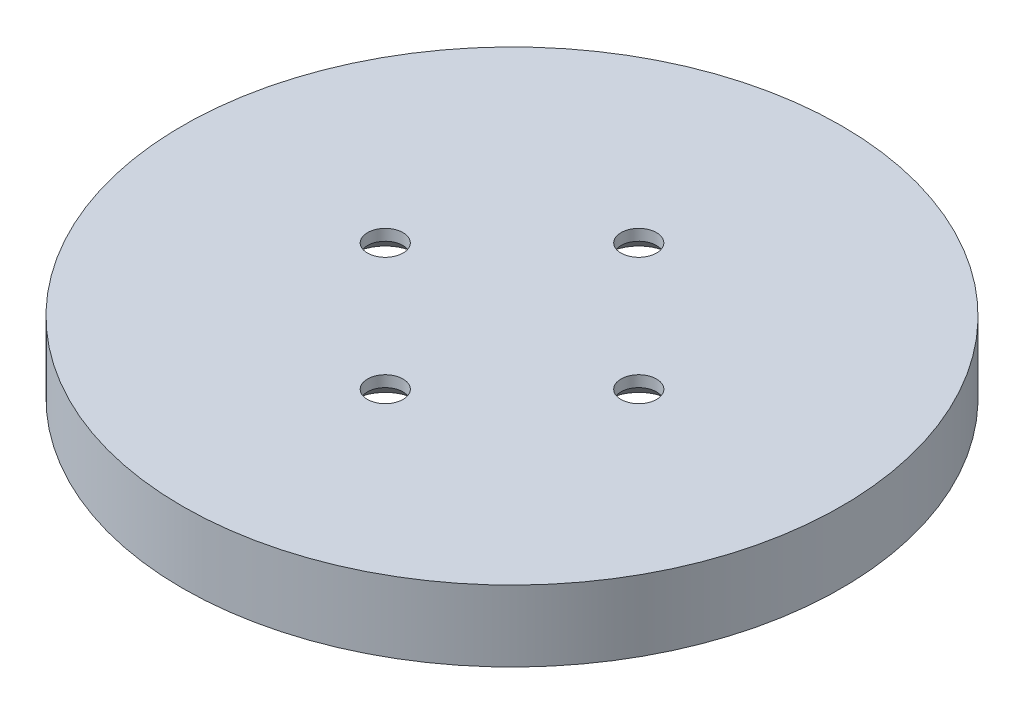
ISO-10303-21;
HEADER;
FILE_DESCRIPTION(('STEP AP214'),'2;1');
FILE_NAME('part.step','',(''),(''),'','','');
FILE_SCHEMA(('AUTOMOTIVE_DESIGN { 1 0 10303 214 1 1 1 1 }'));
ENDSEC;
DATA;
#1=APPLICATION_CONTEXT('core data for automotive mechanical design processes');
#2=APPLICATION_PROTOCOL_DEFINITION('international standard','automotive_design',2000,#1);
#3=PRODUCT_CONTEXT('',#1,'mechanical');
#4=PRODUCT('Part','Part','',(#3));
#5=PRODUCT_RELATED_PRODUCT_CATEGORY('part','',(#4));
#6=PRODUCT_DEFINITION_FORMATION('','',#4);
#7=PRODUCT_DEFINITION_CONTEXT('part definition',#1,'design');
#8=PRODUCT_DEFINITION('design','',#6,#7);
#9=PRODUCT_DEFINITION_SHAPE('','',#8);
#10=(LENGTH_UNIT() NAMED_UNIT(*) SI_UNIT(.MILLI.,.METRE.));
#11=(NAMED_UNIT(*) PLANE_ANGLE_UNIT() SI_UNIT($,.RADIAN.));
#12=(NAMED_UNIT(*) SI_UNIT($,.STERADIAN.) SOLID_ANGLE_UNIT());
#13=UNCERTAINTY_MEASURE_WITH_UNIT(LENGTH_MEASURE(1.E-05),#10,'distance_accuracy_value','');
#14=(GEOMETRIC_REPRESENTATION_CONTEXT(3) GLOBAL_UNCERTAINTY_ASSIGNED_CONTEXT((#13)) GLOBAL_UNIT_ASSIGNED_CONTEXT((#10,
#11,#12)) REPRESENTATION_CONTEXT('',''));
#15=CARTESIAN_POINT('',(0.,0.,0.));
#16=DIRECTION('',(0.,0.,1.));
#17=DIRECTION('',(1.,0.,0.));
#18=AXIS2_PLACEMENT_3D('',#15,#16,#17);
#19=CARTESIAN_POINT('',(0.,-54.,0.));
#20=DIRECTION('',(0.,1.,0.));
#21=DIRECTION('',(0.,0.,1.));
#22=AXIS2_PLACEMENT_3D('',#19,#20,#21);
#23=CYLINDRICAL_SURFACE('',#22,52.6);
#24=CARTESIAN_POINT('',(0.,3.,0.));
#25=DIRECTION('',(0.,-1.,0.));
#26=DIRECTION('',(0.,0.,-1.));
#27=AXIS2_PLACEMENT_3D('',#24,#25,#26);
#28=CIRCLE('',#27,52.6);
#29=CARTESIAN_POINT('',(-52.398473260201,3.,-4.6));
#30=VERTEX_POINT('',#29);
#31=CARTESIAN_POINT('',(52.398473260201,3.,-4.6));
#32=VERTEX_POINT('',#31);
#33=EDGE_CURVE('E324',#30,#32,#28,.T.);
#34=ORIENTED_EDGE('',*,*,#33,.T.);
#35=DIRECTION('',(0.,1.,0.));
#36=VECTOR('',#35,1.);
#37=CARTESIAN_POINT('',(52.398473260201,-54.,-4.6));
#38=LINE('',#37,#36);
#39=CARTESIAN_POINT('',(52.398473260201,6.8,-4.6));
#40=VERTEX_POINT('',#39);
#41=EDGE_CURVE('E168',#32,#40,#38,.T.);
#42=ORIENTED_EDGE('',*,*,#41,.T.);
#43=CARTESIAN_POINT('',(-8.46545056276682E-13,6.8,3.57353036051222E-13));
#44=DIRECTION('',(0.,1.,0.));
#45=DIRECTION('',(0.,0.,-1.));
#46=AXIS2_PLACEMENT_3D('',#43,#44,#45);
#47=CIRCLE('',#46,52.6000000000008);
#48=CARTESIAN_POINT('',(37.1938166904129,6.8,-37.1938166904119));
#49=VERTEX_POINT('',#48);
#50=EDGE_CURVE('E261',#40,#49,#47,.T.);
#51=ORIENTED_EDGE('',*,*,#50,.T.);
#52=DIRECTION('',(0.,1.,0.));
#53=VECTOR('',#52,1.);
#54=CARTESIAN_POINT('',(37.1938166904129,6.8,-37.1938166904119));
#55=LINE('',#54,#53);
#56=CARTESIAN_POINT('',(37.1938166904129,12.,-37.1938166904119));
#57=VERTEX_POINT('',#56);
#58=EDGE_CURVE('E220',#49,#57,#55,.T.);
#59=ORIENTED_EDGE('',*,*,#58,.T.);
#60=CARTESIAN_POINT('',(0.,12.,0.));
#61=DIRECTION('',(0.,1.,0.));
#62=DIRECTION('',(0.,0.,1.));
#63=AXIS2_PLACEMENT_3D('',#60,#61,#62);
#64=CIRCLE('',#63,52.6);
#65=CARTESIAN_POINT('',(-52.398473260201,12.,-4.6));
#66=VERTEX_POINT('',#65);
#67=EDGE_CURVE('E243',#66,#57,#64,.F.);
#68=ORIENTED_EDGE('',*,*,#67,.F.);
#69=DIRECTION('',(0.,1.,0.));
#70=VECTOR('',#69,1.);
#71=CARTESIAN_POINT('',(-52.398473260201,-54.,-4.6));
#72=LINE('',#71,#70);
#73=EDGE_CURVE('E167',#66,#30,#72,.F.);
#74=ORIENTED_EDGE('',*,*,#73,.T.);
#75=EDGE_LOOP('',(#34,#42,#51,#59,#68,#74));
#76=FACE_BOUND('',#75,.T.);
#77=ADVANCED_FACE('F34',(#76),#23,.F.);
#78=CARTESIAN_POINT('',(0.,3.,0.));
#79=DIRECTION('',(0.,-1.,0.));
#80=DIRECTION('',(0.,0.,1.));
#81=AXIS2_PLACEMENT_3D('',#78,#79,#80);
#82=CIRCLE('',#81,52.6);
#83=CARTESIAN_POINT('',(52.398473260201,3.,4.6));
#84=VERTEX_POINT('',#83);
#85=CARTESIAN_POINT('',(-52.398473260201,3.,4.6));
#86=VERTEX_POINT('',#85);
#87=EDGE_CURVE('E148',#84,#86,#82,.T.);
#88=ORIENTED_EDGE('',*,*,#87,.T.);
#89=DIRECTION('',(0.,1.,0.));
#90=VECTOR('',#89,1.);
#91=CARTESIAN_POINT('',(-52.398473260201,-54.,4.6));
#92=LINE('',#91,#90);
#93=CARTESIAN_POINT('',(-52.398473260201,6.8,4.6));
#94=VERTEX_POINT('',#93);
#95=EDGE_CURVE('E159',#86,#94,#92,.T.);
#96=ORIENTED_EDGE('',*,*,#95,.T.);
#97=CARTESIAN_POINT('',(2.08166817117217E-13,6.8,0.));
#98=DIRECTION('',(0.,1.,0.));
#99=DIRECTION('',(0.,0.,-1.));
#100=AXIS2_PLACEMENT_3D('',#97,#98,#99);
#101=CIRCLE('',#100,52.6000000000002);
#102=CARTESIAN_POINT('',(-37.1938166904022,6.8,37.1938166904226));
#103=VERTEX_POINT('',#102);
#104=EDGE_CURVE('E245',#94,#103,#101,.T.);
#105=ORIENTED_EDGE('',*,*,#104,.T.);
#106=DIRECTION('',(0.,1.,0.));
#107=VECTOR('',#106,1.);
#108=CARTESIAN_POINT('',(-37.1938166904022,6.8,37.1938166904226));
#109=LINE('',#108,#107);
#110=CARTESIAN_POINT('',(-37.1938166904022,12.,37.1938166904226));
#111=VERTEX_POINT('',#110);
#112=EDGE_CURVE('E227',#103,#111,#109,.T.);
#113=ORIENTED_EDGE('',*,*,#112,.T.);
#114=CARTESIAN_POINT('',(52.398473260201,12.,4.6));
#115=VERTEX_POINT('',#114);
#116=EDGE_CURVE('E276',#115,#111,#64,.F.);
#117=ORIENTED_EDGE('',*,*,#116,.F.);
#118=DIRECTION('',(0.,1.,0.));
#119=VECTOR('',#118,1.);
#120=CARTESIAN_POINT('',(52.398473260201,-54.,4.6));
#121=LINE('',#120,#119);
#122=EDGE_CURVE('E162',#115,#84,#121,.F.);
#123=ORIENTED_EDGE('',*,*,#122,.T.);
#124=EDGE_LOOP('',(#88,#96,#105,#113,#117,#123));
#125=FACE_BOUND('',#124,.T.);
#126=ADVANCED_FACE('F157',(#125),#23,.F.);
#127=CARTESIAN_POINT('',(0.,30.,0.));
#128=DIRECTION('',(0.,-1.,0.));
#129=DIRECTION('',(0.,0.,-1.));
#130=AXIS2_PLACEMENT_3D('',#127,#128,#129);
#131=CYLINDRICAL_SURFACE('',#130,65.);
#132=CARTESIAN_POINT('',(0.,17.,0.));
#133=DIRECTION('',(0.,1.,0.));
#134=DIRECTION('',(0.,0.,1.));
#135=AXIS2_PLACEMENT_3D('',#132,#133,#134);
#136=CIRCLE('',#135,65.);
#137=CARTESIAN_POINT('',(0.,17.,65.));
#138=VERTEX_POINT('',#137);
#139=EDGE_CURVE('E277',#138,#138,#136,.T.);
#140=ORIENTED_EDGE('',*,*,#139,.F.);
#141=EDGE_LOOP('',(#140));
#142=FACE_BOUND('',#141,.T.);
#143=CARTESIAN_POINT('',(0.,3.,0.));
#144=DIRECTION('',(0.,-1.,0.));
#145=DIRECTION('',(0.,0.,-1.));
#146=AXIS2_PLACEMENT_3D('',#143,#144,#145);
#147=CIRCLE('',#146,65.);
#148=CARTESIAN_POINT('',(0.,3.,-65.));
#149=VERTEX_POINT('',#148);
#150=EDGE_CURVE('E316',#149,#149,#147,.T.);
#151=ORIENTED_EDGE('',*,*,#150,.F.);
#152=EDGE_LOOP('',(#151));
#153=FACE_BOUND('',#152,.T.);
#154=ADVANCED_FACE('F36',(#142,#153),#131,.T.);
#155=CARTESIAN_POINT('',(60.7,12.,4.6));
#156=DIRECTION('',(1.,0.,0.));
#157=DIRECTION('',(0.,0.,-1.));
#158=AXIS2_PLACEMENT_3D('',#155,#156,#157);
#159=PLANE('',#158);
#160=DIRECTION('',(0.,0.,1.));
#161=VECTOR('',#160,1.);
#162=CARTESIAN_POINT('',(60.7,3.,4.6));
#163=LINE('',#162,#161);
#164=CARTESIAN_POINT('',(60.7,3.,-4.6));
#165=VERTEX_POINT('',#164);
#166=CARTESIAN_POINT('',(60.7,3.,4.6));
#167=VERTEX_POINT('',#166);
#168=EDGE_CURVE('E321',#165,#167,#163,.T.);
#169=ORIENTED_EDGE('',*,*,#168,.T.);
#170=DIRECTION('',(0.,-1.,0.));
#171=VECTOR('',#170,1.);
#172=CARTESIAN_POINT('',(60.7,12.,4.6));
#173=LINE('',#172,#171);
#174=CARTESIAN_POINT('',(60.7,12.,4.6));
#175=VERTEX_POINT('',#174);
#176=EDGE_CURVE('E195',#175,#167,#173,.T.);
#177=ORIENTED_EDGE('',*,*,#176,.F.);
#178=DIRECTION('',(0.,0.,1.));
#179=VECTOR('',#178,1.);
#180=CARTESIAN_POINT('',(60.7,12.,4.6));
#181=LINE('',#180,#179);
#182=CARTESIAN_POINT('',(60.7,12.,0.));
#183=VERTEX_POINT('',#182);
#184=EDGE_CURVE('E214',#183,#175,#181,.T.);
#185=ORIENTED_EDGE('',*,*,#184,.F.);
#186=DIRECTION('',(0.,1.,0.));
#187=VECTOR('',#186,1.);
#188=CARTESIAN_POINT('',(60.7,12.,0.));
#189=LINE('',#188,#187);
#190=CARTESIAN_POINT('',(60.7,6.8,0.));
#191=VERTEX_POINT('',#190);
#192=EDGE_CURVE('E11',#191,#183,#189,.T.);
#193=ORIENTED_EDGE('',*,*,#192,.F.);
#194=DIRECTION('',(0.,0.,-1.));
#195=VECTOR('',#194,1.);
#196=CARTESIAN_POINT('',(60.7,6.8,4.6));
#197=LINE('',#196,#195);
#198=CARTESIAN_POINT('',(60.7,6.8,-4.6));
#199=VERTEX_POINT('',#198);
#200=EDGE_CURVE('E42',#191,#199,#197,.T.);
#201=ORIENTED_EDGE('',*,*,#200,.T.);
#202=DIRECTION('',(0.,-1.,0.));
#203=VECTOR('',#202,1.);
#204=CARTESIAN_POINT('',(60.7,12.,-4.6));
#205=LINE('',#204,#203);
#206=EDGE_CURVE('E185',#199,#165,#205,.T.);
#207=ORIENTED_EDGE('',*,*,#206,.T.);
#208=EDGE_LOOP('',(#169,#177,#185,#193,#201,#207));
#209=FACE_BOUND('',#208,.T.);
#210=ADVANCED_FACE('F184',(#209),#159,.F.);
#211=CARTESIAN_POINT('',(-60.7,12.,4.6));
#212=DIRECTION('',(-1.,0.,0.));
#213=DIRECTION('',(0.,0.,1.));
#214=AXIS2_PLACEMENT_3D('',#211,#212,#213);
#215=PLANE('',#214);
#216=DIRECTION('',(0.,0.,-1.));
#217=VECTOR('',#216,1.);
#218=CARTESIAN_POINT('',(-60.7,3.,4.6));
#219=LINE('',#218,#217);
#220=CARTESIAN_POINT('',(-60.7,3.,4.6));
#221=VERTEX_POINT('',#220);
#222=CARTESIAN_POINT('',(-60.7,3.,-4.6));
#223=VERTEX_POINT('',#222);
#224=EDGE_CURVE('E49',#221,#223,#219,.T.);
#225=ORIENTED_EDGE('',*,*,#224,.T.);
#226=DIRECTION('',(0.,-1.,0.));
#227=VECTOR('',#226,1.);
#228=CARTESIAN_POINT('',(-60.7,12.,-4.6));
#229=LINE('',#228,#227);
#230=CARTESIAN_POINT('',(-60.7,12.,-4.6));
#231=VERTEX_POINT('',#230);
#232=EDGE_CURVE('E205',#231,#223,#229,.T.);
#233=ORIENTED_EDGE('',*,*,#232,.F.);
#234=DIRECTION('',(0.,0.,-1.));
#235=VECTOR('',#234,1.);
#236=CARTESIAN_POINT('',(-60.7,12.,4.6));
#237=LINE('',#236,#235);
#238=CARTESIAN_POINT('',(-60.7,12.,0.));
#239=VERTEX_POINT('',#238);
#240=EDGE_CURVE('E194',#239,#231,#237,.T.);
#241=ORIENTED_EDGE('',*,*,#240,.F.);
#242=DIRECTION('',(0.,1.,0.));
#243=VECTOR('',#242,1.);
#244=CARTESIAN_POINT('',(-60.7,12.,0.));
#245=LINE('',#244,#243);
#246=CARTESIAN_POINT('',(-60.7,6.8,0.));
#247=VERTEX_POINT('',#246);
#248=EDGE_CURVE('E178',#247,#239,#245,.T.);
#249=ORIENTED_EDGE('',*,*,#248,.F.);
#250=DIRECTION('',(0.,0.,1.));
#251=VECTOR('',#250,1.);
#252=CARTESIAN_POINT('',(-60.7,6.8,4.6));
#253=LINE('',#252,#251);
#254=CARTESIAN_POINT('',(-60.7,6.8,4.6));
#255=VERTEX_POINT('',#254);
#256=EDGE_CURVE('E171',#247,#255,#253,.T.);
#257=ORIENTED_EDGE('',*,*,#256,.T.);
#258=DIRECTION('',(0.,-1.,0.));
#259=VECTOR('',#258,1.);
#260=CARTESIAN_POINT('',(-60.7,12.,4.6));
#261=LINE('',#260,#259);
#262=EDGE_CURVE('E207',#255,#221,#261,.T.);
#263=ORIENTED_EDGE('',*,*,#262,.T.);
#264=EDGE_LOOP('',(#225,#233,#241,#249,#257,#263));
#265=FACE_BOUND('',#264,.T.);
#266=ADVANCED_FACE('F330',(#265),#215,.F.);
#267=CARTESIAN_POINT('',(44.5,12.,-4.6));
#268=DIRECTION('',(0.,0.,-1.));
#269=DIRECTION('',(-1.,0.,0.));
#270=AXIS2_PLACEMENT_3D('',#267,#268,#269);
#271=PLANE('',#270);
#272=DIRECTION('',(1.,0.,0.));
#273=VECTOR('',#272,1.);
#274=CARTESIAN_POINT('',(60.7,3.,-4.6));
#275=LINE('',#274,#273);
#276=EDGE_CURVE('E193',#32,#165,#275,.T.);
#277=ORIENTED_EDGE('',*,*,#276,.T.);
#278=ORIENTED_EDGE('',*,*,#206,.F.);
#279=DIRECTION('',(-1.,0.,0.));
#280=VECTOR('',#279,1.);
#281=CARTESIAN_POINT('',(44.5,6.8,-4.6));
#282=LINE('',#281,#280);
#283=EDGE_CURVE('E57',#199,#40,#282,.T.);
#284=ORIENTED_EDGE('',*,*,#283,.T.);
#285=ORIENTED_EDGE('',*,*,#41,.F.);
#286=EDGE_LOOP('',(#277,#278,#284,#285));
#287=FACE_BOUND('',#286,.T.);
#288=ADVANCED_FACE('F191',(#287),#271,.F.);
#289=CARTESIAN_POINT('',(44.5,12.,4.6));
#290=DIRECTION('',(0.,0.,1.));
#291=DIRECTION('',(1.,0.,0.));
#292=AXIS2_PLACEMENT_3D('',#289,#290,#291);
#293=PLANE('',#292);
#294=DIRECTION('',(-1.,0.,0.));
#295=VECTOR('',#294,1.);
#296=CARTESIAN_POINT('',(52.398473260201,3.,4.6));
#297=LINE('',#296,#295);
#298=EDGE_CURVE('E319',#167,#84,#297,.T.);
#299=ORIENTED_EDGE('',*,*,#298,.T.);
#300=ORIENTED_EDGE('',*,*,#122,.F.);
#301=DIRECTION('',(-1.,0.,0.));
#302=VECTOR('',#301,1.);
#303=CARTESIAN_POINT('',(44.5,12.,4.6));
#304=LINE('',#303,#302);
#305=EDGE_CURVE('E201',#175,#115,#304,.T.);
#306=ORIENTED_EDGE('',*,*,#305,.F.);
#307=ORIENTED_EDGE('',*,*,#176,.T.);
#308=EDGE_LOOP('',(#299,#300,#306,#307));
#309=FACE_BOUND('',#308,.T.);
#310=ADVANCED_FACE('F351',(#309),#293,.F.);
#311=CARTESIAN_POINT('',(-60.7,12.,-4.6));
#312=DIRECTION('',(0.,0.,-1.));
#313=DIRECTION('',(-1.,0.,0.));
#314=AXIS2_PLACEMENT_3D('',#311,#312,#313);
#315=PLANE('',#314);
#316=DIRECTION('',(1.,0.,0.));
#317=VECTOR('',#316,1.);
#318=CARTESIAN_POINT('',(-60.7,3.,-4.6));
#319=LINE('',#318,#317);
#320=EDGE_CURVE('E327',#223,#30,#319,.T.);
#321=ORIENTED_EDGE('',*,*,#320,.T.);
#322=ORIENTED_EDGE('',*,*,#73,.F.);
#323=DIRECTION('',(1.,0.,0.));
#324=VECTOR('',#323,1.);
#325=CARTESIAN_POINT('',(-60.7,12.,-4.6));
#326=LINE('',#325,#324);
#327=EDGE_CURVE('E198',#231,#66,#326,.T.);
#328=ORIENTED_EDGE('',*,*,#327,.F.);
#329=ORIENTED_EDGE('',*,*,#232,.T.);
#330=EDGE_LOOP('',(#321,#322,#328,#329));
#331=FACE_BOUND('',#330,.T.);
#332=ADVANCED_FACE('F367',(#331),#315,.F.);
#333=CARTESIAN_POINT('',(-60.7,12.,4.6));
#334=DIRECTION('',(0.,0.,1.));
#335=DIRECTION('',(1.,0.,0.));
#336=AXIS2_PLACEMENT_3D('',#333,#334,#335);
#337=PLANE('',#336);
#338=DIRECTION('',(-1.,0.,0.));
#339=VECTOR('',#338,1.);
#340=CARTESIAN_POINT('',(-52.398473260201,3.,4.6));
#341=LINE('',#340,#339);
#342=EDGE_CURVE('E144',#86,#221,#341,.T.);
#343=ORIENTED_EDGE('',*,*,#342,.T.);
#344=ORIENTED_EDGE('',*,*,#262,.F.);
#345=DIRECTION('',(1.,0.,0.));
#346=VECTOR('',#345,1.);
#347=CARTESIAN_POINT('',(-60.7,6.8,4.6));
#348=LINE('',#347,#346);
#349=EDGE_CURVE('E166',#255,#94,#348,.T.);
#350=ORIENTED_EDGE('',*,*,#349,.T.);
#351=ORIENTED_EDGE('',*,*,#95,.F.);
#352=EDGE_LOOP('',(#343,#344,#350,#351));
#353=FACE_BOUND('',#352,.T.);
#354=ADVANCED_FACE('F165',(#353),#337,.F.);
#355=CARTESIAN_POINT('',(-52.6,6.8,0.));
#356=DIRECTION('',(0.,0.,1.));
#357=DIRECTION('',(1.,0.,0.));
#358=AXIS2_PLACEMENT_3D('',#355,#356,#357);
#359=PLANE('',#358);
#360=ORIENTED_EDGE('',*,*,#248,.T.);
#361=DIRECTION('',(1.,0.,0.));
#362=VECTOR('',#361,1.);
#363=CARTESIAN_POINT('',(-52.6,12.,0.));
#364=LINE('',#363,#362);
#365=CARTESIAN_POINT('',(-62.3248280176807,12.,0.));
#366=VERTEX_POINT('',#365);
#367=EDGE_CURVE('E237',#366,#239,#364,.T.);
#368=ORIENTED_EDGE('',*,*,#367,.F.);
#369=DIRECTION('',(0.,1.,0.));
#370=VECTOR('',#369,1.);
#371=CARTESIAN_POINT('',(-62.3248280176807,6.8,0.));
#372=LINE('',#371,#370);
#373=CARTESIAN_POINT('',(-62.3248280176807,6.8,0.));
#374=VERTEX_POINT('',#373);
#375=EDGE_CURVE('E223',#374,#366,#372,.T.);
#376=ORIENTED_EDGE('',*,*,#375,.F.);
#377=DIRECTION('',(1.,0.,0.));
#378=VECTOR('',#377,1.);
#379=CARTESIAN_POINT('',(-52.6,6.8,0.));
#380=LINE('',#379,#378);
#381=EDGE_CURVE('E247',#374,#247,#380,.T.);
#382=ORIENTED_EDGE('',*,*,#381,.T.);
#383=EDGE_LOOP('',(#360,#368,#376,#382));
#384=FACE_BOUND('',#383,.T.);
#385=ADVANCED_FACE('F338',(#384),#359,.T.);
#386=CARTESIAN_POINT('',(0.,6.8,0.));
#387=DIRECTION('',(0.,-1.,0.));
#388=DIRECTION('',(0.,0.,-1.));
#389=AXIS2_PLACEMENT_3D('',#386,#387,#388);
#390=PLANE('',#389);
#391=ORIENTED_EDGE('',*,*,#256,.F.);
#392=ORIENTED_EDGE('',*,*,#381,.F.);
#393=CARTESIAN_POINT('',(0.,6.8,0.));
#394=DIRECTION('',(0.,-1.,0.));
#395=DIRECTION('',(0.,0.,-1.));
#396=AXIS2_PLACEMENT_3D('',#393,#394,#395);
#397=CIRCLE('',#396,62.3248280176807);
#398=CARTESIAN_POINT('',(-44.0703085275763,6.8,44.0703085275984));
#399=VERTEX_POINT('',#398);
#400=EDGE_CURVE('E236',#399,#374,#397,.T.);
#401=ORIENTED_EDGE('',*,*,#400,.F.);
#402=DIRECTION('',(-0.707106781186456,0.,0.707106781186639));
#403=VECTOR('',#402,1.);
#404=CARTESIAN_POINT('',(-37.1938166904022,6.8,37.1938166904226));
#405=LINE('',#404,#403);
#406=EDGE_CURVE('E232',#103,#399,#405,.T.);
#407=ORIENTED_EDGE('',*,*,#406,.F.);
#408=ORIENTED_EDGE('',*,*,#104,.F.);
#409=ORIENTED_EDGE('',*,*,#349,.F.);
#410=EDGE_LOOP('',(#391,#392,#401,#407,#408,#409));
#411=FACE_BOUND('',#410,.T.);
#412=ADVANCED_FACE('F334',(#411),#390,.F.);
#413=CARTESIAN_POINT('',(0.,6.8,0.));
#414=DIRECTION('',(0.,1.,0.));
#415=DIRECTION('',(0.,0.,1.));
#416=AXIS2_PLACEMENT_3D('',#413,#414,#415);
#417=CYLINDRICAL_SURFACE('',#416,62.3248280176807);
#418=CARTESIAN_POINT('',(0.,12.,0.));
#419=DIRECTION('',(0.,-1.,0.));
#420=DIRECTION('',(0.,0.,-1.));
#421=AXIS2_PLACEMENT_3D('',#418,#419,#420);
#422=CIRCLE('',#421,62.3248280176807);
#423=CARTESIAN_POINT('',(-44.0703085275763,12.,44.0703085275984));
#424=VERTEX_POINT('',#423);
#425=EDGE_CURVE('E240',#424,#366,#422,.T.);
#426=ORIENTED_EDGE('',*,*,#425,.F.);
#427=DIRECTION('',(0.,1.,0.));
#428=VECTOR('',#427,1.);
#429=CARTESIAN_POINT('',(-44.0703085275763,6.8,44.0703085275984));
#430=LINE('',#429,#428);
#431=EDGE_CURVE('E230',#399,#424,#430,.T.);
#432=ORIENTED_EDGE('',*,*,#431,.F.);
#433=ORIENTED_EDGE('',*,*,#400,.T.);
#434=ORIENTED_EDGE('',*,*,#375,.T.);
#435=EDGE_LOOP('',(#426,#432,#433,#434));
#436=FACE_BOUND('',#435,.T.);
#437=ADVANCED_FACE('F341',(#436),#417,.F.);
#438=CARTESIAN_POINT('',(-37.1938166904022,6.8,37.1938166904226));
#439=DIRECTION('',(-0.707106781186639,0.,-0.707106781186456));
#440=DIRECTION('',(-0.707106781186456,0.,0.707106781186639));
#441=AXIS2_PLACEMENT_3D('',#438,#439,#440);
#442=PLANE('',#441);
#443=DIRECTION('',(-0.707106781186456,0.,0.707106781186639));
#444=VECTOR('',#443,1.);
#445=CARTESIAN_POINT('',(-37.1938166904022,12.,37.1938166904226));
#446=LINE('',#445,#444);
#447=EDGE_CURVE('E233',#111,#424,#446,.T.);
#448=ORIENTED_EDGE('',*,*,#447,.F.);
#449=ORIENTED_EDGE('',*,*,#112,.F.);
#450=ORIENTED_EDGE('',*,*,#406,.T.);
#451=ORIENTED_EDGE('',*,*,#431,.T.);
#452=EDGE_LOOP('',(#448,#449,#450,#451));
#453=FACE_BOUND('',#452,.T.);
#454=ADVANCED_FACE('F347',(#453),#442,.T.);
#455=CARTESIAN_POINT('',(52.6,6.8,0.));
#456=DIRECTION('',(0.,0.,-1.));
#457=DIRECTION('',(-1.,0.,0.));
#458=AXIS2_PLACEMENT_3D('',#455,#456,#457);
#459=PLANE('',#458);
#460=ORIENTED_EDGE('',*,*,#192,.T.);
#461=DIRECTION('',(-1.,0.,0.));
#462=VECTOR('',#461,1.);
#463=CARTESIAN_POINT('',(52.6,12.,0.));
#464=LINE('',#463,#462);
#465=CARTESIAN_POINT('',(62.3248280176807,12.,0.));
#466=VERTEX_POINT('',#465);
#467=EDGE_CURVE('E259',#466,#183,#464,.T.);
#468=ORIENTED_EDGE('',*,*,#467,.F.);
#469=DIRECTION('',(0.,1.,0.));
#470=VECTOR('',#469,1.);
#471=CARTESIAN_POINT('',(62.3248280176807,6.8,0.));
#472=LINE('',#471,#470);
#473=CARTESIAN_POINT('',(62.3248280176807,6.8,0.));
#474=VERTEX_POINT('',#473);
#475=EDGE_CURVE('E256',#474,#466,#472,.T.);
#476=ORIENTED_EDGE('',*,*,#475,.F.);
#477=DIRECTION('',(-1.,0.,0.));
#478=VECTOR('',#477,1.);
#479=CARTESIAN_POINT('',(52.6,6.8,0.));
#480=LINE('',#479,#478);
#481=EDGE_CURVE('E258',#474,#191,#480,.T.);
#482=ORIENTED_EDGE('',*,*,#481,.T.);
#483=EDGE_LOOP('',(#460,#468,#476,#482));
#484=FACE_BOUND('',#483,.T.);
#485=ADVANCED_FACE('F356',(#484),#459,.T.);
#486=CARTESIAN_POINT('',(-8.46545056276682E-13,6.8,3.57353036051222E-13));
#487=DIRECTION('',(0.,-1.,0.));
#488=DIRECTION('',(0.,0.,-1.));
#489=AXIS2_PLACEMENT_3D('',#486,#487,#488);
#490=PLANE('',#489);
#491=ORIENTED_EDGE('',*,*,#200,.F.);
#492=ORIENTED_EDGE('',*,*,#481,.F.);
#493=CARTESIAN_POINT('',(0.,6.8,0.));
#494=DIRECTION('',(0.,-1.,0.));
#495=DIRECTION('',(0.,0.,-1.));
#496=AXIS2_PLACEMENT_3D('',#493,#494,#495);
#497=CIRCLE('',#496,62.3248280176807);
#498=CARTESIAN_POINT('',(44.0703085275869,6.8,-44.0703085275878));
#499=VERTEX_POINT('',#498);
#500=EDGE_CURVE('E268',#499,#474,#497,.T.);
#501=ORIENTED_EDGE('',*,*,#500,.F.);
#502=DIRECTION('',(0.707106781186455,0.,-0.70710678118664));
#503=VECTOR('',#502,1.);
#504=CARTESIAN_POINT('',(37.1938166904129,6.8,-37.1938166904119));
#505=LINE('',#504,#503);
#506=EDGE_CURVE('E270',#49,#499,#505,.T.);
#507=ORIENTED_EDGE('',*,*,#506,.F.);
#508=ORIENTED_EDGE('',*,*,#50,.F.);
#509=ORIENTED_EDGE('',*,*,#283,.F.);
#510=EDGE_LOOP('',(#491,#492,#501,#507,#508,#509));
#511=FACE_BOUND('',#510,.T.);
#512=ADVANCED_FACE('F358',(#511),#490,.F.);
#513=CARTESIAN_POINT('',(37.1938166904129,6.8,-37.1938166904119));
#514=DIRECTION('',(0.70710678118664,0.,0.707106781186455));
#515=DIRECTION('',(0.707106781186455,0.,-0.70710678118664));
#516=AXIS2_PLACEMENT_3D('',#513,#514,#515);
#517=PLANE('',#516);
#518=DIRECTION('',(0.707106781186455,0.,-0.70710678118664));
#519=VECTOR('',#518,1.);
#520=CARTESIAN_POINT('',(37.1938166904129,12.,-37.1938166904119));
#521=LINE('',#520,#519);
#522=CARTESIAN_POINT('',(44.0703085275869,12.,-44.0703085275878));
#523=VERTEX_POINT('',#522);
#524=EDGE_CURVE('E226',#57,#523,#521,.T.);
#525=ORIENTED_EDGE('',*,*,#524,.F.);
#526=ORIENTED_EDGE('',*,*,#58,.F.);
#527=ORIENTED_EDGE('',*,*,#506,.T.);
#528=DIRECTION('',(0.,1.,0.));
#529=VECTOR('',#528,1.);
#530=CARTESIAN_POINT('',(44.0703085275869,6.8,-44.0703085275878));
#531=LINE('',#530,#529);
#532=EDGE_CURVE('E254',#499,#523,#531,.T.);
#533=ORIENTED_EDGE('',*,*,#532,.T.);
#534=EDGE_LOOP('',(#525,#526,#527,#533));
#535=FACE_BOUND('',#534,.T.);
#536=ADVANCED_FACE('F364',(#535),#517,.T.);
#537=CARTESIAN_POINT('',(0.,6.8,0.));
#538=DIRECTION('',(0.,1.,0.));
#539=DIRECTION('',(0.,0.,1.));
#540=AXIS2_PLACEMENT_3D('',#537,#538,#539);
#541=CYLINDRICAL_SURFACE('',#540,62.3248280176807);
#542=CARTESIAN_POINT('',(0.,12.,0.));
#543=DIRECTION('',(0.,-1.,0.));
#544=DIRECTION('',(0.,0.,-1.));
#545=AXIS2_PLACEMENT_3D('',#542,#543,#544);
#546=CIRCLE('',#545,62.3248280176807);
#547=EDGE_CURVE('E262',#523,#466,#546,.T.);
#548=ORIENTED_EDGE('',*,*,#547,.F.);
#549=ORIENTED_EDGE('',*,*,#532,.F.);
#550=ORIENTED_EDGE('',*,*,#500,.T.);
#551=ORIENTED_EDGE('',*,*,#475,.T.);
#552=EDGE_LOOP('',(#548,#549,#550,#551));
#553=FACE_BOUND('',#552,.T.);
#554=ADVANCED_FACE('F362',(#553),#541,.F.);
#555=CARTESIAN_POINT('',(0.,12.,0.));
#556=DIRECTION('',(0.,1.,0.));
#557=DIRECTION('',(0.,0.,1.));
#558=AXIS2_PLACEMENT_3D('',#555,#556,#557);
#559=PLANE('',#558);
#560=CARTESIAN_POINT('',(-25.,12.,0.));
#561=DIRECTION('',(0.,-1.,0.));
#562=DIRECTION('',(0.,0.,-1.));
#563=AXIS2_PLACEMENT_3D('',#560,#561,#562);
#564=CIRCLE('',#563,6.3);
#565=CARTESIAN_POINT('',(-25.,12.,-6.3));
#566=VERTEX_POINT('',#565);
#567=EDGE_CURVE('E313',#566,#566,#564,.T.);
#568=ORIENTED_EDGE('',*,*,#567,.F.);
#569=EDGE_LOOP('',(#568));
#570=FACE_BOUND('',#569,.T.);
#571=CARTESIAN_POINT('',(0.,12.,25.));
#572=DIRECTION('',(0.,-1.,0.));
#573=DIRECTION('',(0.,0.,-1.));
#574=AXIS2_PLACEMENT_3D('',#571,#572,#573);
#575=CIRCLE('',#574,6.3);
#576=CARTESIAN_POINT('',(0.,12.,18.7));
#577=VERTEX_POINT('',#576);
#578=EDGE_CURVE('E304',#577,#577,#575,.T.);
#579=ORIENTED_EDGE('',*,*,#578,.F.);
#580=EDGE_LOOP('',(#579));
#581=FACE_BOUND('',#580,.T.);
#582=CARTESIAN_POINT('',(0.,12.,-25.));
#583=DIRECTION('',(0.,-1.,0.));
#584=DIRECTION('',(0.,0.,-1.));
#585=AXIS2_PLACEMENT_3D('',#582,#583,#584);
#586=CIRCLE('',#585,6.3);
#587=CARTESIAN_POINT('',(0.,12.,-31.3));
#588=VERTEX_POINT('',#587);
#589=EDGE_CURVE('E295',#588,#588,#586,.T.);
#590=ORIENTED_EDGE('',*,*,#589,.F.);
#591=EDGE_LOOP('',(#590));
#592=FACE_BOUND('',#591,.T.);
#593=CARTESIAN_POINT('',(25.,12.,0.));
#594=DIRECTION('',(0.,-1.,0.));
#595=DIRECTION('',(0.,0.,-1.));
#596=AXIS2_PLACEMENT_3D('',#593,#594,#595);
#597=CIRCLE('',#596,6.3);
#598=CARTESIAN_POINT('',(25.,12.,-6.3));
#599=VERTEX_POINT('',#598);
#600=EDGE_CURVE('E286',#599,#599,#597,.T.);
#601=ORIENTED_EDGE('',*,*,#600,.F.);
#602=EDGE_LOOP('',(#601));
#603=FACE_BOUND('',#602,.T.);
#604=ORIENTED_EDGE('',*,*,#327,.T.);
#605=ORIENTED_EDGE('',*,*,#67,.T.);
#606=ORIENTED_EDGE('',*,*,#524,.T.);
#607=ORIENTED_EDGE('',*,*,#547,.T.);
#608=ORIENTED_EDGE('',*,*,#467,.T.);
#609=ORIENTED_EDGE('',*,*,#184,.T.);
#610=ORIENTED_EDGE('',*,*,#305,.T.);
#611=ORIENTED_EDGE('',*,*,#116,.T.);
#612=ORIENTED_EDGE('',*,*,#447,.T.);
#613=ORIENTED_EDGE('',*,*,#425,.T.);
#614=ORIENTED_EDGE('',*,*,#367,.T.);
#615=ORIENTED_EDGE('',*,*,#240,.T.);
#616=EDGE_LOOP('',(#604,#605,#606,#607,#608,#609,#610,#611,#612,#613,#614,#615));
#617=FACE_BOUND('',#616,.T.);
#618=ADVANCED_FACE('F344',(#570,#581,#592,#603,#617),#559,.F.);
#619=CARTESIAN_POINT('',(0.,17.,0.));
#620=DIRECTION('',(0.,1.,0.));
#621=DIRECTION('',(0.,0.,1.));
#622=AXIS2_PLACEMENT_3D('',#619,#620,#621);
#623=PLANE('',#622);
#624=CARTESIAN_POINT('',(-25.,17.,0.));
#625=DIRECTION('',(0.,-1.,0.));
#626=DIRECTION('',(0.,0.,-1.));
#627=AXIS2_PLACEMENT_3D('',#624,#625,#626);
#628=CIRCLE('',#627,3.5);
#629=CARTESIAN_POINT('',(-25.,17.,-3.5));
#630=VERTEX_POINT('',#629);
#631=EDGE_CURVE('E307',#630,#630,#628,.T.);
#632=ORIENTED_EDGE('',*,*,#631,.T.);
#633=EDGE_LOOP('',(#632));
#634=FACE_BOUND('',#633,.T.);
#635=CARTESIAN_POINT('',(0.,17.,25.));
#636=DIRECTION('',(0.,-1.,0.));
#637=DIRECTION('',(0.,0.,-1.));
#638=AXIS2_PLACEMENT_3D('',#635,#636,#637);
#639=CIRCLE('',#638,3.5);
#640=CARTESIAN_POINT('',(0.,17.,21.5));
#641=VERTEX_POINT('',#640);
#642=EDGE_CURVE('E298',#641,#641,#639,.T.);
#643=ORIENTED_EDGE('',*,*,#642,.T.);
#644=EDGE_LOOP('',(#643));
#645=FACE_BOUND('',#644,.T.);
#646=CARTESIAN_POINT('',(0.,17.,-25.));
#647=DIRECTION('',(0.,-1.,0.));
#648=DIRECTION('',(0.,0.,-1.));
#649=AXIS2_PLACEMENT_3D('',#646,#647,#648);
#650=CIRCLE('',#649,3.5);
#651=CARTESIAN_POINT('',(0.,17.,-28.5));
#652=VERTEX_POINT('',#651);
#653=EDGE_CURVE('E289',#652,#652,#650,.T.);
#654=ORIENTED_EDGE('',*,*,#653,.T.);
#655=EDGE_LOOP('',(#654));
#656=FACE_BOUND('',#655,.T.);
#657=CARTESIAN_POINT('',(25.,17.,0.));
#658=DIRECTION('',(0.,-1.,0.));
#659=DIRECTION('',(0.,0.,-1.));
#660=AXIS2_PLACEMENT_3D('',#657,#658,#659);
#661=CIRCLE('',#660,3.5);
#662=CARTESIAN_POINT('',(25.,17.,-3.5));
#663=VERTEX_POINT('',#662);
#664=EDGE_CURVE('E280',#663,#663,#661,.T.);
#665=ORIENTED_EDGE('',*,*,#664,.T.);
#666=EDGE_LOOP('',(#665));
#667=FACE_BOUND('',#666,.T.);
#668=ORIENTED_EDGE('',*,*,#139,.T.);
#669=EDGE_LOOP('',(#668));
#670=FACE_BOUND('',#669,.T.);
#671=ADVANCED_FACE('F487',(#634,#645,#656,#667,#670),#623,.T.);
#672=CARTESIAN_POINT('',(25.,12.,0.));
#673=DIRECTION('',(0.,-1.,0.));
#674=DIRECTION('',(0.,0.,-1.));
#675=AXIS2_PLACEMENT_3D('',#672,#673,#674);
#676=CYLINDRICAL_SURFACE('',#675,3.5);
#677=ORIENTED_EDGE('',*,*,#664,.F.);
#678=EDGE_LOOP('',(#677));
#679=FACE_BOUND('',#678,.T.);
#680=CARTESIAN_POINT('',(25.,14.8,0.));
#681=DIRECTION('',(0.,-1.,0.));
#682=DIRECTION('',(0.,0.,-1.));
#683=AXIS2_PLACEMENT_3D('',#680,#681,#682);
#684=CIRCLE('',#683,3.5);
#685=CARTESIAN_POINT('',(25.,14.8,-3.5));
#686=VERTEX_POINT('',#685);
#687=EDGE_CURVE('E283',#686,#686,#684,.T.);
#688=ORIENTED_EDGE('',*,*,#687,.T.);
#689=EDGE_LOOP('',(#688));
#690=FACE_BOUND('',#689,.T.);
#691=ADVANCED_FACE('F478',(#679,#690),#676,.F.);
#692=CARTESIAN_POINT('',(25.,12.,0.));
#693=DIRECTION('',(0.,-1.,0.));
#694=DIRECTION('',(0.,0.,-1.));
#695=AXIS2_PLACEMENT_3D('',#692,#693,#694);
#696=CONICAL_SURFACE('',#695,6.3,0.785398163397448);
#697=ORIENTED_EDGE('',*,*,#687,.F.);
#698=EDGE_LOOP('',(#697));
#699=FACE_BOUND('',#698,.T.);
#700=ORIENTED_EDGE('',*,*,#600,.T.);
#701=EDGE_LOOP('',(#700));
#702=FACE_BOUND('',#701,.T.);
#703=ADVANCED_FACE('F469',(#699,#702),#696,.F.);
#704=CARTESIAN_POINT('',(0.,12.,-25.));
#705=DIRECTION('',(0.,-1.,0.));
#706=DIRECTION('',(0.,0.,-1.));
#707=AXIS2_PLACEMENT_3D('',#704,#705,#706);
#708=CYLINDRICAL_SURFACE('',#707,3.5);
#709=ORIENTED_EDGE('',*,*,#653,.F.);
#710=EDGE_LOOP('',(#709));
#711=FACE_BOUND('',#710,.T.);
#712=CARTESIAN_POINT('',(0.,14.8,-25.));
#713=DIRECTION('',(0.,-1.,0.));
#714=DIRECTION('',(0.,0.,-1.));
#715=AXIS2_PLACEMENT_3D('',#712,#713,#714);
#716=CIRCLE('',#715,3.5);
#717=CARTESIAN_POINT('',(0.,14.8,-28.5));
#718=VERTEX_POINT('',#717);
#719=EDGE_CURVE('E292',#718,#718,#716,.T.);
#720=ORIENTED_EDGE('',*,*,#719,.T.);
#721=EDGE_LOOP('',(#720));
#722=FACE_BOUND('',#721,.T.);
#723=ADVANCED_FACE('F460',(#711,#722),#708,.F.);
#724=CARTESIAN_POINT('',(0.,12.,-25.));
#725=DIRECTION('',(0.,-1.,0.));
#726=DIRECTION('',(0.,0.,-1.));
#727=AXIS2_PLACEMENT_3D('',#724,#725,#726);
#728=CONICAL_SURFACE('',#727,6.3,0.785398163397448);
#729=ORIENTED_EDGE('',*,*,#719,.F.);
#730=EDGE_LOOP('',(#729));
#731=FACE_BOUND('',#730,.T.);
#732=ORIENTED_EDGE('',*,*,#589,.T.);
#733=EDGE_LOOP('',(#732));
#734=FACE_BOUND('',#733,.T.);
#735=ADVANCED_FACE('F451',(#731,#734),#728,.F.);
#736=CARTESIAN_POINT('',(0.,12.,25.));
#737=DIRECTION('',(0.,-1.,0.));
#738=DIRECTION('',(0.,0.,-1.));
#739=AXIS2_PLACEMENT_3D('',#736,#737,#738);
#740=CYLINDRICAL_SURFACE('',#739,3.5);
#741=ORIENTED_EDGE('',*,*,#642,.F.);
#742=EDGE_LOOP('',(#741));
#743=FACE_BOUND('',#742,.T.);
#744=CARTESIAN_POINT('',(0.,14.8,25.));
#745=DIRECTION('',(0.,-1.,0.));
#746=DIRECTION('',(0.,0.,-1.));
#747=AXIS2_PLACEMENT_3D('',#744,#745,#746);
#748=CIRCLE('',#747,3.5);
#749=CARTESIAN_POINT('',(0.,14.8,21.5));
#750=VERTEX_POINT('',#749);
#751=EDGE_CURVE('E301',#750,#750,#748,.T.);
#752=ORIENTED_EDGE('',*,*,#751,.T.);
#753=EDGE_LOOP('',(#752));
#754=FACE_BOUND('',#753,.T.);
#755=ADVANCED_FACE('F442',(#743,#754),#740,.F.);
#756=CARTESIAN_POINT('',(0.,12.,25.));
#757=DIRECTION('',(0.,-1.,0.));
#758=DIRECTION('',(0.,0.,-1.));
#759=AXIS2_PLACEMENT_3D('',#756,#757,#758);
#760=CONICAL_SURFACE('',#759,6.3,0.785398163397448);
#761=ORIENTED_EDGE('',*,*,#751,.F.);
#762=EDGE_LOOP('',(#761));
#763=FACE_BOUND('',#762,.T.);
#764=ORIENTED_EDGE('',*,*,#578,.T.);
#765=EDGE_LOOP('',(#764));
#766=FACE_BOUND('',#765,.T.);
#767=ADVANCED_FACE('F433',(#763,#766),#760,.F.);
#768=CARTESIAN_POINT('',(-25.,12.,0.));
#769=DIRECTION('',(0.,-1.,0.));
#770=DIRECTION('',(0.,0.,-1.));
#771=AXIS2_PLACEMENT_3D('',#768,#769,#770);
#772=CYLINDRICAL_SURFACE('',#771,3.5);
#773=ORIENTED_EDGE('',*,*,#631,.F.);
#774=EDGE_LOOP('',(#773));
#775=FACE_BOUND('',#774,.T.);
#776=CARTESIAN_POINT('',(-25.,14.8,0.));
#777=DIRECTION('',(0.,-1.,0.));
#778=DIRECTION('',(0.,0.,-1.));
#779=AXIS2_PLACEMENT_3D('',#776,#777,#778);
#780=CIRCLE('',#779,3.5);
#781=CARTESIAN_POINT('',(-25.,14.8,-3.5));
#782=VERTEX_POINT('',#781);
#783=EDGE_CURVE('E310',#782,#782,#780,.T.);
#784=ORIENTED_EDGE('',*,*,#783,.T.);
#785=EDGE_LOOP('',(#784));
#786=FACE_BOUND('',#785,.T.);
#787=ADVANCED_FACE('F424',(#775,#786),#772,.F.);
#788=CARTESIAN_POINT('',(-25.,12.,0.));
#789=DIRECTION('',(0.,-1.,0.));
#790=DIRECTION('',(0.,0.,-1.));
#791=AXIS2_PLACEMENT_3D('',#788,#789,#790);
#792=CONICAL_SURFACE('',#791,6.3,0.785398163397448);
#793=ORIENTED_EDGE('',*,*,#783,.F.);
#794=EDGE_LOOP('',(#793));
#795=FACE_BOUND('',#794,.T.);
#796=ORIENTED_EDGE('',*,*,#567,.T.);
#797=EDGE_LOOP('',(#796));
#798=FACE_BOUND('',#797,.T.);
#799=ADVANCED_FACE('F420',(#795,#798),#792,.F.);
#800=CARTESIAN_POINT('',(0.,3.,0.));
#801=DIRECTION('',(0.,-1.,0.));
#802=DIRECTION('',(0.,0.,-1.));
#803=AXIS2_PLACEMENT_3D('',#800,#801,#802);
#804=PLANE('',#803);
#805=ORIENTED_EDGE('',*,*,#298,.F.);
#806=ORIENTED_EDGE('',*,*,#168,.F.);
#807=ORIENTED_EDGE('',*,*,#276,.F.);
#808=ORIENTED_EDGE('',*,*,#33,.F.);
#809=ORIENTED_EDGE('',*,*,#320,.F.);
#810=ORIENTED_EDGE('',*,*,#224,.F.);
#811=ORIENTED_EDGE('',*,*,#342,.F.);
#812=ORIENTED_EDGE('',*,*,#87,.F.);
#813=EDGE_LOOP('',(#805,#806,#807,#808,#809,#810,#811,#812));
#814=FACE_BOUND('',#813,.T.);
#815=ORIENTED_EDGE('',*,*,#150,.T.);
#816=EDGE_LOOP('',(#815));
#817=FACE_BOUND('',#816,.T.);
#818=ADVANCED_FACE('F146',(#814,#817),#804,.T.);
#819=CLOSED_SHELL('',(#77,#126,#154,#210,#266,#288,#310,#332,#354,#385,#412,#437,#454,#485,#512,
#536,#554,#618,#671,#691,#703,#723,#735,#755,#767,#787,#799,#818));
#820=MANIFOLD_SOLID_BREP('B2',#819);
#821=ADVANCED_BREP_SHAPE_REPRESENTATION('',(#18,#820),#14);
#822=SHAPE_DEFINITION_REPRESENTATION(#9,#821);
ENDSEC;
END-ISO-10303-21;
